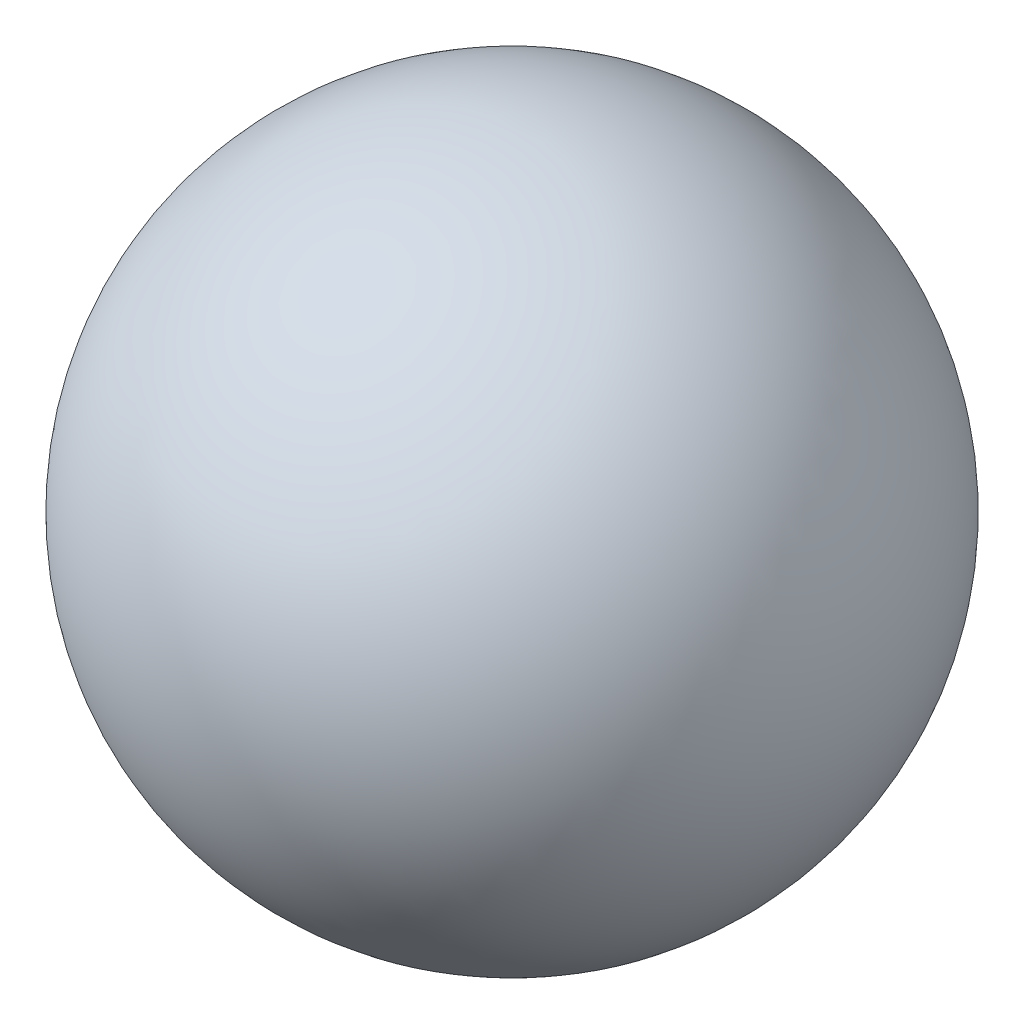
ISO-10303-21;
HEADER;
FILE_DESCRIPTION(('STEP AP214'),'2;1');
FILE_NAME('part.step','',(''),(''),'','','');
FILE_SCHEMA(('AUTOMOTIVE_DESIGN { 1 0 10303 214 1 1 1 1 }'));
ENDSEC;
DATA;
#1=APPLICATION_CONTEXT('core data for automotive mechanical design processes');
#2=APPLICATION_PROTOCOL_DEFINITION('international standard','automotive_design',2000,#1);
#3=PRODUCT_CONTEXT('',#1,'mechanical');
#4=PRODUCT('Part','Part','',(#3));
#5=PRODUCT_RELATED_PRODUCT_CATEGORY('part','',(#4));
#6=PRODUCT_DEFINITION_FORMATION('','',#4);
#7=PRODUCT_DEFINITION_CONTEXT('part definition',#1,'design');
#8=PRODUCT_DEFINITION('design','',#6,#7);
#9=PRODUCT_DEFINITION_SHAPE('','',#8);
#10=(LENGTH_UNIT() NAMED_UNIT(*) SI_UNIT(.MILLI.,.METRE.));
#11=(NAMED_UNIT(*) PLANE_ANGLE_UNIT() SI_UNIT($,.RADIAN.));
#12=(NAMED_UNIT(*) SI_UNIT($,.STERADIAN.) SOLID_ANGLE_UNIT());
#13=UNCERTAINTY_MEASURE_WITH_UNIT(LENGTH_MEASURE(1.E-05),#10,'distance_accuracy_value','');
#14=(GEOMETRIC_REPRESENTATION_CONTEXT(3) GLOBAL_UNCERTAINTY_ASSIGNED_CONTEXT((#13)) GLOBAL_UNIT_ASSIGNED_CONTEXT((#10,
#11,#12)) REPRESENTATION_CONTEXT('',''));
#15=CARTESIAN_POINT('',(0.,0.,0.));
#16=DIRECTION('',(0.,0.,1.));
#17=DIRECTION('',(1.,0.,0.));
#18=AXIS2_PLACEMENT_3D('',#15,#16,#17);
#19=CARTESIAN_POINT('',(18.6448763483294,-21.6452012779456,0.));
#20=DIRECTION('',(0.,1.,0.));
#21=DIRECTION('',(1.,0.,0.));
#22=AXIS2_PLACEMENT_3D('',#19,#20,#21);
#23=SPHERICAL_SURFACE('',#22,62.5782056748526);
#24=CARTESIAN_POINT('',(18.6448763483294,40.933004396907,0.));
#25=VERTEX_POINT('',#24);
#26=VERTEX_LOOP('',#25);
#27=FACE_BOUND('',#26,.T.);
#28=ADVANCED_FACE('F29',(#27),#23,.T.);
#29=CLOSED_SHELL('',(#28));
#30=MANIFOLD_SOLID_BREP('B2',#29);
#31=ADVANCED_BREP_SHAPE_REPRESENTATION('',(#18,#30),#14);
#32=SHAPE_DEFINITION_REPRESENTATION(#9,#31);
ENDSEC;
END-ISO-10303-21;
